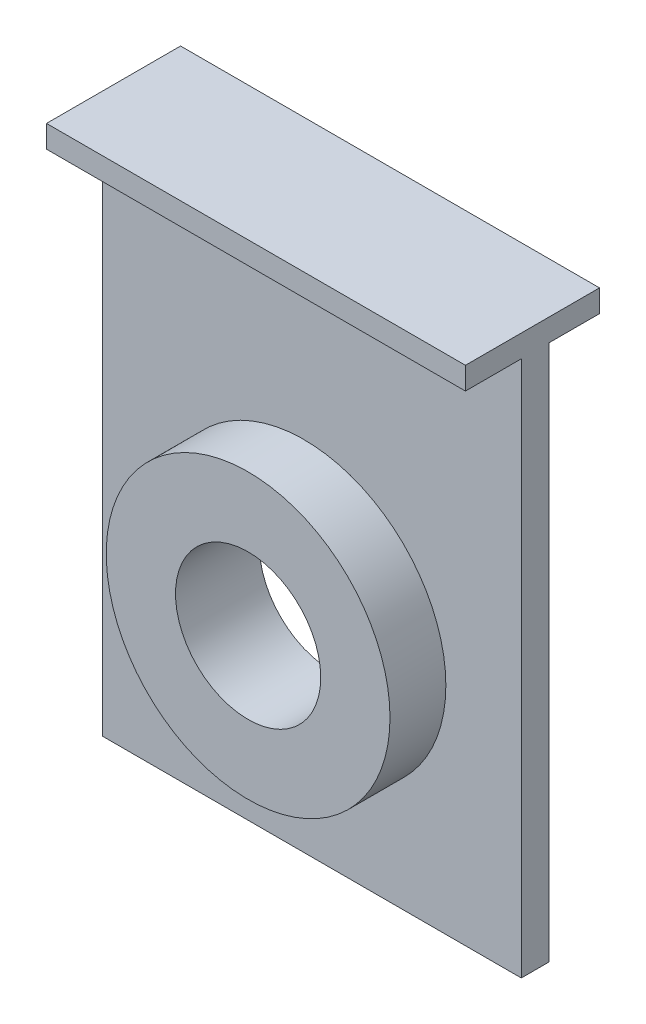
ISO-10303-21;
HEADER;
FILE_DESCRIPTION(('STEP AP214'),'2;1');
FILE_NAME('part.step','',(''),(''),'','','');
FILE_SCHEMA(('AUTOMOTIVE_DESIGN { 1 0 10303 214 1 1 1 1 }'));
ENDSEC;
DATA;
#1=APPLICATION_CONTEXT('core data for automotive mechanical design processes');
#2=APPLICATION_PROTOCOL_DEFINITION('international standard','automotive_design',2000,#1);
#3=PRODUCT_CONTEXT('',#1,'mechanical');
#4=PRODUCT('Part','Part','',(#3));
#5=PRODUCT_RELATED_PRODUCT_CATEGORY('part','',(#4));
#6=PRODUCT_DEFINITION_FORMATION('','',#4);
#7=PRODUCT_DEFINITION_CONTEXT('part definition',#1,'design');
#8=PRODUCT_DEFINITION('design','',#6,#7);
#9=PRODUCT_DEFINITION_SHAPE('','',#8);
#10=(LENGTH_UNIT() NAMED_UNIT(*) SI_UNIT(.MILLI.,.METRE.));
#11=(NAMED_UNIT(*) PLANE_ANGLE_UNIT() SI_UNIT($,.RADIAN.));
#12=(NAMED_UNIT(*) SI_UNIT($,.STERADIAN.) SOLID_ANGLE_UNIT());
#13=UNCERTAINTY_MEASURE_WITH_UNIT(LENGTH_MEASURE(1.E-05),#10,'distance_accuracy_value','');
#14=(GEOMETRIC_REPRESENTATION_CONTEXT(3) GLOBAL_UNCERTAINTY_ASSIGNED_CONTEXT((#13)) GLOBAL_UNIT_ASSIGNED_CONTEXT((#10,
#11,#12)) REPRESENTATION_CONTEXT('',''));
#15=CARTESIAN_POINT('',(0.,0.,0.));
#16=DIRECTION('',(0.,0.,1.));
#17=DIRECTION('',(1.,0.,0.));
#18=AXIS2_PLACEMENT_3D('',#15,#16,#17);
#19=CARTESIAN_POINT('',(62.1258493643405,0.,5.));
#20=DIRECTION('',(-1.,0.,0.));
#21=DIRECTION('',(0.,-1.,0.));
#22=AXIS2_PLACEMENT_3D('',#19,#20,#21);
#23=PLANE('',#22);
#24=DIRECTION('',(0.,1.,0.));
#25=VECTOR('',#24,1.);
#26=CARTESIAN_POINT('',(62.1258493643405,0.,5.));
#27=LINE('',#26,#25);
#28=CARTESIAN_POINT('',(62.1258493643405,0.,5.));
#29=VERTEX_POINT('',#28);
#30=CARTESIAN_POINT('',(62.1258493643405,96.,5.));
#31=VERTEX_POINT('',#30);
#32=EDGE_CURVE('E137',#29,#31,#27,.T.);
#33=ORIENTED_EDGE('',*,*,#32,.T.);
#34=DIRECTION('',(0.,0.,1.));
#35=VECTOR('',#34,1.);
#36=CARTESIAN_POINT('',(62.1258493643405,96.,-9.));
#37=LINE('',#36,#35);
#38=CARTESIAN_POINT('',(62.1258493643405,96.,15.));
#39=VERTEX_POINT('',#38);
#40=EDGE_CURVE('E92',#31,#39,#37,.T.);
#41=ORIENTED_EDGE('',*,*,#40,.T.);
#42=DIRECTION('',(0.,-1.,0.));
#43=VECTOR('',#42,1.);
#44=CARTESIAN_POINT('',(62.1258493643405,100.,15.));
#45=LINE('',#44,#43);
#46=CARTESIAN_POINT('',(62.1258493643405,100.,15.));
#47=VERTEX_POINT('',#46);
#48=EDGE_CURVE('E90',#47,#39,#45,.T.);
#49=ORIENTED_EDGE('',*,*,#48,.F.);
#50=DIRECTION('',(0.,0.,-1.));
#51=VECTOR('',#50,1.);
#52=CARTESIAN_POINT('',(62.1258493643405,100.,5.));
#53=LINE('',#52,#51);
#54=CARTESIAN_POINT('',(62.1258493643405,100.,-9.));
#55=VERTEX_POINT('',#54);
#56=EDGE_CURVE('E77',#47,#55,#53,.T.);
#57=ORIENTED_EDGE('',*,*,#56,.T.);
#58=DIRECTION('',(0.,-1.,0.));
#59=VECTOR('',#58,1.);
#60=CARTESIAN_POINT('',(62.1258493643405,100.,-9.));
#61=LINE('',#60,#59);
#62=CARTESIAN_POINT('',(62.1258493643405,96.,-9.));
#63=VERTEX_POINT('',#62);
#64=EDGE_CURVE('E107',#55,#63,#61,.T.);
#65=ORIENTED_EDGE('',*,*,#64,.T.);
#66=CARTESIAN_POINT('',(62.1258493643405,96.,0.));
#67=VERTEX_POINT('',#66);
#68=EDGE_CURVE('E120',#63,#67,#37,.T.);
#69=ORIENTED_EDGE('',*,*,#68,.T.);
#70=DIRECTION('',(0.,1.,0.));
#71=VECTOR('',#70,1.);
#72=CARTESIAN_POINT('',(62.1258493643405,0.,0.));
#73=LINE('',#72,#71);
#74=CARTESIAN_POINT('',(62.1258493643405,0.,0.));
#75=VERTEX_POINT('',#74);
#76=EDGE_CURVE('E33',#75,#67,#73,.T.);
#77=ORIENTED_EDGE('',*,*,#76,.F.);
#78=DIRECTION('',(0.,0.,-1.));
#79=VECTOR('',#78,1.);
#80=CARTESIAN_POINT('',(62.1258493643405,0.,5.));
#81=LINE('',#80,#79);
#82=EDGE_CURVE('E136',#29,#75,#81,.T.);
#83=ORIENTED_EDGE('',*,*,#82,.F.);
#84=EDGE_LOOP('',(#33,#41,#49,#57,#65,#69,#77,#83));
#85=FACE_BOUND('',#84,.T.);
#86=ADVANCED_FACE('F16',(#85),#23,.T.);
#87=CARTESIAN_POINT('',(62.1258493643405,0.,5.));
#88=DIRECTION('',(0.,1.,0.));
#89=DIRECTION('',(-1.,0.,0.));
#90=AXIS2_PLACEMENT_3D('',#87,#88,#89);
#91=PLANE('',#90);
#92=DIRECTION('',(1.,0.,0.));
#93=VECTOR('',#92,1.);
#94=CARTESIAN_POINT('',(62.1258493643405,0.,0.));
#95=LINE('',#94,#93);
#96=CARTESIAN_POINT('',(137.12584936434,0.,0.));
#97=VERTEX_POINT('',#96);
#98=EDGE_CURVE('E140',#75,#97,#95,.T.);
#99=ORIENTED_EDGE('',*,*,#98,.T.);
#100=DIRECTION('',(0.,0.,-1.));
#101=VECTOR('',#100,1.);
#102=CARTESIAN_POINT('',(137.12584936434,0.,5.));
#103=LINE('',#102,#101);
#104=CARTESIAN_POINT('',(137.12584936434,0.,5.));
#105=VERTEX_POINT('',#104);
#106=EDGE_CURVE('E150',#105,#97,#103,.T.);
#107=ORIENTED_EDGE('',*,*,#106,.F.);
#108=DIRECTION('',(1.,0.,0.));
#109=VECTOR('',#108,1.);
#110=CARTESIAN_POINT('',(62.1258493643405,0.,5.));
#111=LINE('',#110,#109);
#112=EDGE_CURVE('E88',#29,#105,#111,.T.);
#113=ORIENTED_EDGE('',*,*,#112,.F.);
#114=ORIENTED_EDGE('',*,*,#82,.T.);
#115=EDGE_LOOP('',(#99,#107,#113,#114));
#116=FACE_BOUND('',#115,.T.);
#117=ADVANCED_FACE('F165',(#116),#91,.F.);
#118=CARTESIAN_POINT('',(137.12584936434,100.,5.));
#119=DIRECTION('',(1.,0.,0.));
#120=DIRECTION('',(0.,0.,-1.));
#121=AXIS2_PLACEMENT_3D('',#118,#119,#120);
#122=PLANE('',#121);
#123=DIRECTION('',(0.,-1.,0.));
#124=VECTOR('',#123,1.);
#125=CARTESIAN_POINT('',(137.12584936434,100.,0.));
#126=LINE('',#125,#124);
#127=CARTESIAN_POINT('',(137.12584936434,96.,0.));
#128=VERTEX_POINT('',#127);
#129=EDGE_CURVE('E145',#128,#97,#126,.T.);
#130=ORIENTED_EDGE('',*,*,#129,.F.);
#131=DIRECTION('',(0.,0.,1.));
#132=VECTOR('',#131,1.);
#133=CARTESIAN_POINT('',(137.12584936434,96.,-9.));
#134=LINE('',#133,#132);
#135=CARTESIAN_POINT('',(137.12584936434,96.,-9.));
#136=VERTEX_POINT('',#135);
#137=EDGE_CURVE('E115',#136,#128,#134,.T.);
#138=ORIENTED_EDGE('',*,*,#137,.F.);
#139=DIRECTION('',(0.,1.,0.));
#140=VECTOR('',#139,1.);
#141=CARTESIAN_POINT('',(137.12584936434,96.,-9.));
#142=LINE('',#141,#140);
#143=CARTESIAN_POINT('',(137.12584936434,100.,-9.));
#144=VERTEX_POINT('',#143);
#145=EDGE_CURVE('E112',#136,#144,#142,.T.);
#146=ORIENTED_EDGE('',*,*,#145,.T.);
#147=DIRECTION('',(0.,0.,-1.));
#148=VECTOR('',#147,1.);
#149=CARTESIAN_POINT('',(137.12584936434,100.,5.));
#150=LINE('',#149,#148);
#151=CARTESIAN_POINT('',(137.12584936434,100.,15.));
#152=VERTEX_POINT('',#151);
#153=EDGE_CURVE('E87',#152,#144,#150,.T.);
#154=ORIENTED_EDGE('',*,*,#153,.F.);
#155=DIRECTION('',(0.,1.,0.));
#156=VECTOR('',#155,1.);
#157=CARTESIAN_POINT('',(137.12584936434,96.,15.));
#158=LINE('',#157,#156);
#159=CARTESIAN_POINT('',(137.12584936434,96.,15.));
#160=VERTEX_POINT('',#159);
#161=EDGE_CURVE('E101',#160,#152,#158,.T.);
#162=ORIENTED_EDGE('',*,*,#161,.F.);
#163=CARTESIAN_POINT('',(137.12584936434,96.,5.));
#164=VERTEX_POINT('',#163);
#165=EDGE_CURVE('E119',#164,#160,#134,.T.);
#166=ORIENTED_EDGE('',*,*,#165,.F.);
#167=DIRECTION('',(0.,-1.,0.));
#168=VECTOR('',#167,1.);
#169=CARTESIAN_POINT('',(137.12584936434,100.,5.));
#170=LINE('',#169,#168);
#171=EDGE_CURVE('E139',#164,#105,#170,.T.);
#172=ORIENTED_EDGE('',*,*,#171,.T.);
#173=ORIENTED_EDGE('',*,*,#106,.T.);
#174=EDGE_LOOP('',(#130,#138,#146,#154,#162,#166,#172,#173));
#175=FACE_BOUND('',#174,.T.);
#176=ADVANCED_FACE('F158',(#175),#122,.T.);
#177=CARTESIAN_POINT('',(62.1258493643405,100.,5.));
#178=DIRECTION('',(0.,1.,0.));
#179=DIRECTION('',(0.,0.,1.));
#180=AXIS2_PLACEMENT_3D('',#177,#178,#179);
#181=PLANE('',#180);
#182=ORIENTED_EDGE('',*,*,#153,.T.);
#183=DIRECTION('',(-1.,0.,0.));
#184=VECTOR('',#183,1.);
#185=CARTESIAN_POINT('',(137.12584936434,100.,-9.));
#186=LINE('',#185,#184);
#187=EDGE_CURVE('E83',#144,#55,#186,.T.);
#188=ORIENTED_EDGE('',*,*,#187,.T.);
#189=ORIENTED_EDGE('',*,*,#56,.F.);
#190=DIRECTION('',(-1.,0.,0.));
#191=VECTOR('',#190,1.);
#192=CARTESIAN_POINT('',(137.12584936434,100.,15.));
#193=LINE('',#192,#191);
#194=EDGE_CURVE('E81',#152,#47,#193,.T.);
#195=ORIENTED_EDGE('',*,*,#194,.F.);
#196=EDGE_LOOP('',(#182,#188,#189,#195));
#197=FACE_BOUND('',#196,.T.);
#198=ADVANCED_FACE('F79',(#197),#181,.T.);
#199=CARTESIAN_POINT('',(0.,0.,5.));
#200=DIRECTION('',(0.,0.,-1.));
#201=DIRECTION('',(-1.,0.,0.));
#202=AXIS2_PLACEMENT_3D('',#199,#200,#201);
#203=PLANE('',#202);
#204=CARTESIAN_POINT('',(98.2196206034018,38.6276036338557,5.));
#205=DIRECTION('',(0.,0.,1.));
#206=DIRECTION('',(1.,0.,0.));
#207=AXIS2_PLACEMENT_3D('',#204,#205,#206);
#208=CIRCLE('',#207,25.4);
#209=CARTESIAN_POINT('',(123.619620603402,38.6276036338557,5.));
#210=VERTEX_POINT('',#209);
#211=EDGE_CURVE('E23',#210,#210,#208,.T.);
#212=ORIENTED_EDGE('',*,*,#211,.F.);
#213=EDGE_LOOP('',(#212));
#214=FACE_BOUND('',#213,.T.);
#215=ORIENTED_EDGE('',*,*,#171,.F.);
#216=DIRECTION('',(-1.,0.,0.));
#217=VECTOR('',#216,1.);
#218=CARTESIAN_POINT('',(0.,96.,5.));
#219=LINE('',#218,#217);
#220=EDGE_CURVE('E118',#164,#31,#219,.T.);
#221=ORIENTED_EDGE('',*,*,#220,.T.);
#222=ORIENTED_EDGE('',*,*,#32,.F.);
#223=ORIENTED_EDGE('',*,*,#112,.T.);
#224=EDGE_LOOP('',(#215,#221,#222,#223));
#225=FACE_BOUND('',#224,.T.);
#226=ADVANCED_FACE('F168',(#214,#225),#203,.F.);
#227=CARTESIAN_POINT('',(0.,0.,0.));
#228=DIRECTION('',(0.,0.,-1.));
#229=DIRECTION('',(-1.,0.,0.));
#230=AXIS2_PLACEMENT_3D('',#227,#228,#229);
#231=PLANE('',#230);
#232=DIRECTION('',(-1.,0.,0.));
#233=VECTOR('',#232,1.);
#234=CARTESIAN_POINT('',(0.,96.,0.));
#235=LINE('',#234,#233);
#236=EDGE_CURVE('E10',#128,#67,#235,.T.);
#237=ORIENTED_EDGE('',*,*,#236,.F.);
#238=ORIENTED_EDGE('',*,*,#129,.T.);
#239=ORIENTED_EDGE('',*,*,#98,.F.);
#240=ORIENTED_EDGE('',*,*,#76,.T.);
#241=EDGE_LOOP('',(#237,#238,#239,#240));
#242=FACE_BOUND('',#241,.T.);
#243=CARTESIAN_POINT('',(98.2196206034018,38.6276036338557,0.));
#244=DIRECTION('',(0.,0.,1.));
#245=DIRECTION('',(1.,0.,0.));
#246=AXIS2_PLACEMENT_3D('',#243,#244,#245);
#247=CIRCLE('',#246,13.);
#248=CARTESIAN_POINT('',(111.219620603402,38.6276036338557,0.));
#249=VERTEX_POINT('',#248);
#250=EDGE_CURVE('E126',#249,#249,#247,.T.);
#251=ORIENTED_EDGE('',*,*,#250,.T.);
#252=EDGE_LOOP('',(#251));
#253=FACE_BOUND('',#252,.T.);
#254=ADVANCED_FACE('F172',(#242,#253),#231,.T.);
#255=CARTESIAN_POINT('',(98.2196206034018,38.6276036338557,15.));
#256=DIRECTION('',(0.,0.,-1.));
#257=DIRECTION('',(-1.,0.,0.));
#258=AXIS2_PLACEMENT_3D('',#255,#256,#257);
#259=CYLINDRICAL_SURFACE('',#258,25.4);
#260=CARTESIAN_POINT('',(98.2196206034018,38.6276036338557,15.));
#261=DIRECTION('',(0.,0.,1.));
#262=DIRECTION('',(1.,0.,0.));
#263=AXIS2_PLACEMENT_3D('',#260,#261,#262);
#264=CIRCLE('',#263,25.4);
#265=CARTESIAN_POINT('',(123.619620603402,38.6276036338557,15.));
#266=VERTEX_POINT('',#265);
#267=EDGE_CURVE('E129',#266,#266,#264,.T.);
#268=ORIENTED_EDGE('',*,*,#267,.F.);
#269=EDGE_LOOP('',(#268));
#270=FACE_BOUND('',#269,.T.);
#271=ORIENTED_EDGE('',*,*,#211,.T.);
#272=EDGE_LOOP('',(#271));
#273=FACE_BOUND('',#272,.T.);
#274=ADVANCED_FACE('F175',(#270,#273),#259,.T.);
#275=CARTESIAN_POINT('',(98.2196206034018,38.6276036338557,15.));
#276=DIRECTION('',(0.,0.,1.));
#277=DIRECTION('',(1.,0.,0.));
#278=AXIS2_PLACEMENT_3D('',#275,#276,#277);
#279=PLANE('',#278);
#280=CARTESIAN_POINT('',(98.2196206034018,38.6276036338557,15.));
#281=DIRECTION('',(0.,0.,1.));
#282=DIRECTION('',(1.,0.,0.));
#283=AXIS2_PLACEMENT_3D('',#280,#281,#282);
#284=CIRCLE('',#283,13.);
#285=CARTESIAN_POINT('',(111.219620603402,38.6276036338557,15.));
#286=VERTEX_POINT('',#285);
#287=EDGE_CURVE('E125',#286,#286,#284,.T.);
#288=ORIENTED_EDGE('',*,*,#287,.F.);
#289=EDGE_LOOP('',(#288));
#290=FACE_BOUND('',#289,.T.);
#291=ORIENTED_EDGE('',*,*,#267,.T.);
#292=EDGE_LOOP('',(#291));
#293=FACE_BOUND('',#292,.T.);
#294=ADVANCED_FACE('F182',(#290,#293),#279,.T.);
#295=CARTESIAN_POINT('',(98.2196206034018,38.6276036338557,0.));
#296=DIRECTION('',(0.,0.,1.));
#297=DIRECTION('',(1.,0.,0.));
#298=AXIS2_PLACEMENT_3D('',#295,#296,#297);
#299=CYLINDRICAL_SURFACE('',#298,13.);
#300=ORIENTED_EDGE('',*,*,#250,.F.);
#301=EDGE_LOOP('',(#300));
#302=FACE_BOUND('',#301,.T.);
#303=ORIENTED_EDGE('',*,*,#287,.T.);
#304=EDGE_LOOP('',(#303));
#305=FACE_BOUND('',#304,.T.);
#306=ADVANCED_FACE('F179',(#302,#305),#299,.F.);
#307=CARTESIAN_POINT('',(0.,0.,-9.));
#308=DIRECTION('',(0.,0.,1.));
#309=DIRECTION('',(1.,0.,0.));
#310=AXIS2_PLACEMENT_3D('',#307,#308,#309);
#311=PLANE('',#310);
#312=ORIENTED_EDGE('',*,*,#187,.F.);
#313=ORIENTED_EDGE('',*,*,#145,.F.);
#314=DIRECTION('',(1.,0.,0.));
#315=VECTOR('',#314,1.);
#316=CARTESIAN_POINT('',(62.1258493643405,96.,-9.));
#317=LINE('',#316,#315);
#318=EDGE_CURVE('E109',#63,#136,#317,.T.);
#319=ORIENTED_EDGE('',*,*,#318,.F.);
#320=ORIENTED_EDGE('',*,*,#64,.F.);
#321=EDGE_LOOP('',(#312,#313,#319,#320));
#322=FACE_BOUND('',#321,.T.);
#323=ADVANCED_FACE('F156',(#322),#311,.F.);
#324=CARTESIAN_POINT('',(62.1258493643405,96.,-9.));
#325=DIRECTION('',(0.,-1.,0.));
#326=DIRECTION('',(0.,0.,-1.));
#327=AXIS2_PLACEMENT_3D('',#324,#325,#326);
#328=PLANE('',#327);
#329=ORIENTED_EDGE('',*,*,#137,.T.);
#330=ORIENTED_EDGE('',*,*,#236,.T.);
#331=ORIENTED_EDGE('',*,*,#68,.F.);
#332=ORIENTED_EDGE('',*,*,#318,.T.);
#333=EDGE_LOOP('',(#329,#330,#331,#332));
#334=FACE_BOUND('',#333,.T.);
#335=ADVANCED_FACE('F160',(#334),#328,.T.);
#336=ORIENTED_EDGE('',*,*,#220,.F.);
#337=ORIENTED_EDGE('',*,*,#165,.T.);
#338=DIRECTION('',(1.,0.,0.));
#339=VECTOR('',#338,1.);
#340=CARTESIAN_POINT('',(62.1258493643405,96.,15.));
#341=LINE('',#340,#339);
#342=EDGE_CURVE('E96',#39,#160,#341,.T.);
#343=ORIENTED_EDGE('',*,*,#342,.F.);
#344=ORIENTED_EDGE('',*,*,#40,.F.);
#345=EDGE_LOOP('',(#336,#337,#343,#344));
#346=FACE_BOUND('',#345,.T.);
#347=ADVANCED_FACE('F171',(#346),#328,.T.);
#348=CARTESIAN_POINT('',(0.,0.,15.));
#349=DIRECTION('',(0.,0.,1.));
#350=DIRECTION('',(1.,0.,0.));
#351=AXIS2_PLACEMENT_3D('',#348,#349,#350);
#352=PLANE('',#351);
#353=ORIENTED_EDGE('',*,*,#194,.T.);
#354=ORIENTED_EDGE('',*,*,#48,.T.);
#355=ORIENTED_EDGE('',*,*,#342,.T.);
#356=ORIENTED_EDGE('',*,*,#161,.T.);
#357=EDGE_LOOP('',(#353,#354,#355,#356));
#358=FACE_BOUND('',#357,.T.);
#359=ADVANCED_FACE('F99',(#358),#352,.T.);
#360=CLOSED_SHELL('',(#86,#117,#176,#198,#226,#254,#274,#294,#306,#323,#335,#347,#359));
#361=MANIFOLD_SOLID_BREP('B1',#360);
#362=ADVANCED_BREP_SHAPE_REPRESENTATION('',(#18,#361),#14);
#363=SHAPE_DEFINITION_REPRESENTATION(#9,#362);
ENDSEC;
END-ISO-10303-21;
